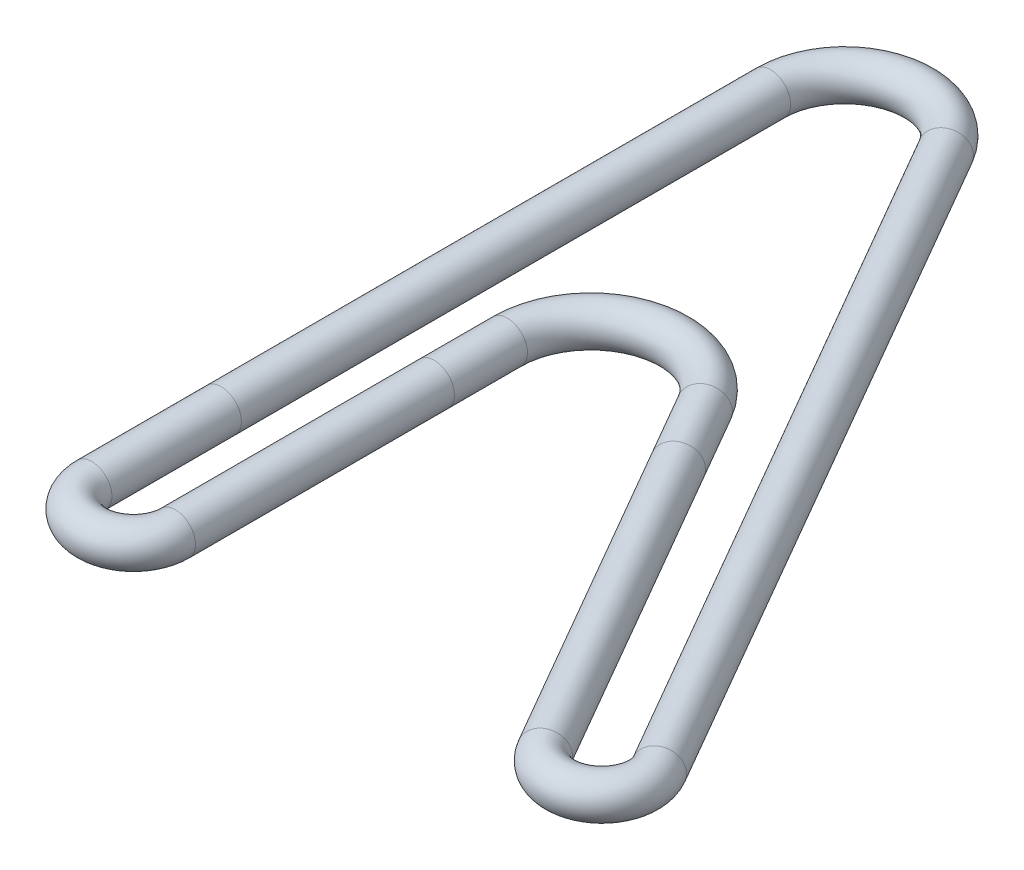
ISO-10303-21;
HEADER;
FILE_DESCRIPTION(('STEP AP214'),'2;1');
FILE_NAME('part.step','',(''),(''),'','','');
FILE_SCHEMA(('AUTOMOTIVE_DESIGN { 1 0 10303 214 1 1 1 1 }'));
ENDSEC;
DATA;
#1=APPLICATION_CONTEXT('core data for automotive mechanical design processes');
#2=APPLICATION_PROTOCOL_DEFINITION('international standard','automotive_design',2000,#1);
#3=PRODUCT_CONTEXT('',#1,'mechanical');
#4=PRODUCT('Part','Part','',(#3));
#5=PRODUCT_RELATED_PRODUCT_CATEGORY('part','',(#4));
#6=PRODUCT_DEFINITION_FORMATION('','',#4);
#7=PRODUCT_DEFINITION_CONTEXT('part definition',#1,'design');
#8=PRODUCT_DEFINITION('design','',#6,#7);
#9=PRODUCT_DEFINITION_SHAPE('','',#8);
#10=(LENGTH_UNIT() NAMED_UNIT(*) SI_UNIT(.MILLI.,.METRE.));
#11=(NAMED_UNIT(*) PLANE_ANGLE_UNIT() SI_UNIT($,.RADIAN.));
#12=(NAMED_UNIT(*) SI_UNIT($,.STERADIAN.) SOLID_ANGLE_UNIT());
#13=UNCERTAINTY_MEASURE_WITH_UNIT(LENGTH_MEASURE(1.E-05),#10,'distance_accuracy_value','');
#14=(GEOMETRIC_REPRESENTATION_CONTEXT(3) GLOBAL_UNCERTAINTY_ASSIGNED_CONTEXT((#13)) GLOBAL_UNIT_ASSIGNED_CONTEXT((#10,
#11,#12)) REPRESENTATION_CONTEXT('',''));
#15=CARTESIAN_POINT('',(0.,0.,0.));
#16=DIRECTION('',(0.,0.,1.));
#17=DIRECTION('',(1.,0.,0.));
#18=AXIS2_PLACEMENT_3D('',#15,#16,#17);
#19=CARTESIAN_POINT('',(-2.38125,0.,-6.34999999999999));
#20=DIRECTION('',(0.,0.,-1.));
#21=DIRECTION('',(-1.,0.,0.));
#22=AXIS2_PLACEMENT_3D('',#19,#20,#21);
#23=CYLINDRICAL_SURFACE('',#22,2.38125);
#24=CARTESIAN_POINT('',(-2.38125,0.,-21.5944419392821));
#25=DIRECTION('',(0.,0.,-1.));
#26=DIRECTION('',(-1.,0.,0.));
#27=AXIS2_PLACEMENT_3D('',#24,#25,#26);
#28=CIRCLE('',#27,2.38125);
#29=CARTESIAN_POINT('',(-4.7625,0.,-21.5944419392821));
#30=VERTEX_POINT('',#29);
#31=EDGE_CURVE('E68',#30,#30,#28,.T.);
#32=ORIENTED_EDGE('',*,*,#31,.F.);
#33=EDGE_LOOP('',(#32));
#34=FACE_BOUND('',#33,.T.);
#35=CARTESIAN_POINT('',(-2.38124999999996,0.,-6.34999999999999));
#36=DIRECTION('',(0.,0.,-1.));
#37=DIRECTION('',(-1.,0.,0.));
#38=AXIS2_PLACEMENT_3D('',#35,#36,#37);
#39=CIRCLE('',#38,2.38125);
#40=CARTESIAN_POINT('',(-4.7625,0.,-6.34999999999999));
#41=VERTEX_POINT('',#40);
#42=EDGE_CURVE('E10',#41,#41,#39,.T.);
#43=ORIENTED_EDGE('',*,*,#42,.T.);
#44=EDGE_LOOP('',(#43));
#45=FACE_BOUND('',#44,.T.);
#46=ADVANCED_FACE('F31',(#34,#45),#23,.T.);
#47=CARTESIAN_POINT('',(2.54,0.,-6.35));
#48=DIRECTION('',(0.,-1.,0.));
#49=DIRECTION('',(0.,0.,-1.));
#50=AXIS2_PLACEMENT_3D('',#47,#48,#49);
#51=TOROIDAL_SURFACE('',#50,4.92125,2.38125);
#52=CARTESIAN_POINT('',(7.46125,0.,-6.35));
#53=DIRECTION('',(0.,0.,1.));
#54=DIRECTION('',(1.,0.,0.));
#55=AXIS2_PLACEMENT_3D('',#52,#53,#54);
#56=CIRCLE('',#55,2.38125);
#57=CARTESIAN_POINT('',(9.8425,0.,-6.35));
#58=VERTEX_POINT('',#57);
#59=EDGE_CURVE('E37',#58,#58,#56,.T.);
#60=CARTESIAN_POINT('',(2.54,0.,-6.35));
#61=DIRECTION('',(0.,-1.,0.));
#62=DIRECTION('',(0.,0.,-1.));
#63=AXIS2_PLACEMENT_3D('',#60,#61,#62);
#64=CIRCLE('',#63,7.3025);
#65=EDGE_CURVE('',#58,#41,#64,.T.);
#66=ORIENTED_EDGE('',*,*,#59,.T.);
#67=ORIENTED_EDGE('',*,*,#42,.F.);
#68=ORIENTED_EDGE('',*,*,#65,.T.);
#69=ORIENTED_EDGE('',*,*,#65,.F.);
#70=EDGE_LOOP('',(#66,#68,#67,#69));
#71=FACE_BOUND('',#70,.T.);
#72=ADVANCED_FACE('F75',(#71),#51,.T.);
#73=CARTESIAN_POINT('',(7.46125,0.,-36.8388838785642));
#74=DIRECTION('',(0.,0.,1.));
#75=DIRECTION('',(1.,0.,0.));
#76=AXIS2_PLACEMENT_3D('',#73,#74,#75);
#77=CYLINDRICAL_SURFACE('',#76,2.38125);
#78=ORIENTED_EDGE('',*,*,#59,.F.);
#79=EDGE_LOOP('',(#78));
#80=FACE_BOUND('',#79,.T.);
#81=CARTESIAN_POINT('',(7.46125,0.,-36.8388838785642));
#82=DIRECTION('',(0.,0.,1.));
#83=DIRECTION('',(1.,0.,0.));
#84=AXIS2_PLACEMENT_3D('',#81,#82,#83);
#85=CIRCLE('',#84,2.38125);
#86=CARTESIAN_POINT('',(9.8425,0.,-36.8388838785642));
#87=VERTEX_POINT('',#86);
#88=EDGE_CURVE('E41',#87,#87,#85,.T.);
#89=ORIENTED_EDGE('',*,*,#88,.T.);
#90=EDGE_LOOP('',(#89));
#91=FACE_BOUND('',#90,.T.);
#92=ADVANCED_FACE('F79',(#80,#91),#77,.T.);
#93=CARTESIAN_POINT('',(7.46125,0.,-45.4453842408075));
#94=DIRECTION('',(0.,0.,1.));
#95=DIRECTION('',(1.,0.,0.));
#96=AXIS2_PLACEMENT_3D('',#93,#94,#95);
#97=CYLINDRICAL_SURFACE('',#96,2.38125);
#98=ORIENTED_EDGE('',*,*,#88,.F.);
#99=EDGE_LOOP('',(#98));
#100=FACE_BOUND('',#99,.T.);
#101=CARTESIAN_POINT('',(7.46125,0.,-45.4453842408075));
#102=DIRECTION('',(0.,0.,1.));
#103=DIRECTION('',(1.,0.,0.));
#104=AXIS2_PLACEMENT_3D('',#101,#102,#103);
#105=CIRCLE('',#104,2.38125);
#106=CARTESIAN_POINT('',(5.08,0.,-45.4453842408075));
#107=VERTEX_POINT('',#106);
#108=EDGE_CURVE('E45',#107,#107,#105,.T.);
#109=ORIENTED_EDGE('',*,*,#108,.T.);
#110=EDGE_LOOP('',(#109));
#111=FACE_BOUND('',#110,.T.);
#112=ADVANCED_FACE('F84',(#100,#111),#97,.T.);
#113=CARTESIAN_POINT('',(17.2933985542007,0.,-45.4453842408075));
#114=DIRECTION('',(0.,1.,0.));
#115=DIRECTION('',(0.,0.,1.));
#116=AXIS2_PLACEMENT_3D('',#113,#114,#115);
#117=TOROIDAL_SURFACE('',#116,9.83214855420072,2.38125);
#118=CARTESIAN_POINT('',(25.808288975921,0.,-50.3614585179079));
#119=DIRECTION('',(-0.500000000000001,0.,-0.866025403784438));
#120=DIRECTION('',(-0.866025403784438,0.,0.500000000000001));
#121=AXIS2_PLACEMENT_3D('',#118,#119,#120);
#122=CIRCLE('',#121,2.38125);
#123=CARTESIAN_POINT('',(27.8705119686827,0.,-51.5520835179079));
#124=VERTEX_POINT('',#123);
#125=EDGE_CURVE('E50',#124,#124,#122,.T.);
#126=CARTESIAN_POINT('',(17.2933985542007,0.,-45.4453842408075));
#127=DIRECTION('',(0.,1.,0.));
#128=DIRECTION('',(0.,0.,1.));
#129=AXIS2_PLACEMENT_3D('',#126,#127,#128);
#130=CIRCLE('',#129,12.2133985542007);
#131=EDGE_CURVE('',#124,#107,#130,.T.);
#132=ORIENTED_EDGE('',*,*,#125,.T.);
#133=ORIENTED_EDGE('',*,*,#108,.F.);
#134=ORIENTED_EDGE('',*,*,#131,.T.);
#135=ORIENTED_EDGE('',*,*,#131,.F.);
#136=EDGE_LOOP('',(#132,#134,#133,#135));
#137=FACE_BOUND('',#136,.T.);
#138=ADVANCED_FACE('F90',(#137),#117,.T.);
#139=CARTESIAN_POINT('',(30.1115391570426,0.,-42.9080105665252));
#140=DIRECTION('',(-0.500000000000001,0.,-0.866025403784438));
#141=DIRECTION('',(-0.866025403784438,0.,0.500000000000001));
#142=AXIS2_PLACEMENT_3D('',#139,#140,#141);
#143=CYLINDRICAL_SURFACE('',#142,2.38125);
#144=ORIENTED_EDGE('',*,*,#125,.F.);
#145=EDGE_LOOP('',(#144));
#146=FACE_BOUND('',#145,.T.);
#147=CARTESIAN_POINT('',(30.1115391570426,0.,-42.9080105665252));
#148=DIRECTION('',(-0.5,0.,-0.866025403784438));
#149=DIRECTION('',(-0.866025403784438,0.,0.5));
#150=AXIS2_PLACEMENT_3D('',#147,#148,#149);
#151=CIRCLE('',#150,2.38125);
#152=CARTESIAN_POINT('',(28.0493161642809,0.,-41.7173855665252));
#153=VERTEX_POINT('',#152);
#154=EDGE_CURVE('E53',#153,#153,#151,.T.);
#155=ORIENTED_EDGE('',*,*,#154,.T.);
#156=EDGE_LOOP('',(#155));
#157=FACE_BOUND('',#156,.T.);
#158=ADVANCED_FACE('F94',(#146,#157),#143,.T.);
#159=CARTESIAN_POINT('',(51.5391066419818,0.,-5.7943749999998));
#160=DIRECTION('',(-0.5,0.,-0.866025403784439));
#161=DIRECTION('',(-0.866025403784439,0.,0.5));
#162=AXIS2_PLACEMENT_3D('',#159,#160,#161);
#163=CYLINDRICAL_SURFACE('',#162,2.38125);
#164=ORIENTED_EDGE('',*,*,#154,.F.);
#165=EDGE_LOOP('',(#164));
#166=FACE_BOUND('',#165,.T.);
#167=CARTESIAN_POINT('',(51.5391066419818,0.,-5.7943749999998));
#168=DIRECTION('',(-0.499999999999998,0.,-0.86602540378444));
#169=DIRECTION('',(-0.86602540378444,0.,0.499999999999998));
#170=AXIS2_PLACEMENT_3D('',#167,#168,#169);
#171=CIRCLE('',#170,2.38125);
#172=CARTESIAN_POINT('',(49.4768836492201,0.,-4.60374999999981));
#173=VERTEX_POINT('',#172);
#174=EDGE_CURVE('E56',#173,#173,#171,.T.);
#175=ORIENTED_EDGE('',*,*,#174,.T.);
#176=EDGE_LOOP('',(#175));
#177=FACE_BOUND('',#176,.T.);
#178=ADVANCED_FACE('F98',(#166,#177),#163,.T.);
#179=CARTESIAN_POINT('',(55.8010341603559,0.,-8.25499999999979));
#180=DIRECTION('',(0.,-1.,0.));
#181=DIRECTION('',(0.,0.,-1.));
#182=AXIS2_PLACEMENT_3D('',#179,#180,#181);
#183=TOROIDAL_SURFACE('',#182,4.92125,2.38125);
#184=CARTESIAN_POINT('',(60.0629616787301,0.,-10.7156249999998));
#185=DIRECTION('',(0.5,0.,0.866025403784439));
#186=DIRECTION('',(0.866025403784439,0.,-0.5));
#187=AXIS2_PLACEMENT_3D('',#184,#185,#186);
#188=CIRCLE('',#187,2.38125);
#189=CARTESIAN_POINT('',(62.1251846714918,0.,-11.9062499999998));
#190=VERTEX_POINT('',#189);
#191=EDGE_CURVE('E59',#190,#190,#188,.T.);
#192=CARTESIAN_POINT('',(55.8010341603559,0.,-8.25499999999979));
#193=DIRECTION('',(0.,-1.,0.));
#194=DIRECTION('',(0.,0.,-1.));
#195=AXIS2_PLACEMENT_3D('',#192,#193,#194);
#196=CIRCLE('',#195,7.3025);
#197=EDGE_CURVE('',#190,#173,#196,.T.);
#198=ORIENTED_EDGE('',*,*,#191,.T.);
#199=ORIENTED_EDGE('',*,*,#174,.F.);
#200=ORIENTED_EDGE('',*,*,#197,.T.);
#201=ORIENTED_EDGE('',*,*,#197,.F.);
#202=EDGE_LOOP('',(#198,#200,#199,#201));
#203=FACE_BOUND('',#202,.T.);
#204=ADVANCED_FACE('F102',(#203),#183,.T.);
#205=CARTESIAN_POINT('',(13.9114843067929,0.,-90.6523286525604));
#206=DIRECTION('',(0.5,0.,0.866025403784439));
#207=DIRECTION('',(0.866025403784439,0.,-0.5));
#208=AXIS2_PLACEMENT_3D('',#205,#206,#207);
#209=CYLINDRICAL_SURFACE('',#208,2.38125);
#210=ORIENTED_EDGE('',*,*,#191,.F.);
#211=EDGE_LOOP('',(#210));
#212=FACE_BOUND('',#211,.T.);
#213=CARTESIAN_POINT('',(13.9114843067929,0.,-90.6523286525604));
#214=DIRECTION('',(0.500000000000004,0.,0.866025403784436));
#215=DIRECTION('',(0.866025403784436,0.,-0.500000000000004));
#216=AXIS2_PLACEMENT_3D('',#213,#214,#215);
#217=CIRCLE('',#216,2.38125);
#218=CARTESIAN_POINT('',(15.9737072995545,0.,-91.8429536525604));
#219=VERTEX_POINT('',#218);
#220=EDGE_CURVE('E62',#219,#219,#217,.T.);
#221=ORIENTED_EDGE('',*,*,#220,.T.);
#222=EDGE_LOOP('',(#221));
#223=FACE_BOUND('',#222,.T.);
#224=ADVANCED_FACE('F106',(#212,#223),#209,.T.);
#225=CARTESIAN_POINT('',(6.35,0.,-86.2867036525604));
#226=DIRECTION('',(0.,-1.,0.));
#227=DIRECTION('',(0.,0.,-1.));
#228=AXIS2_PLACEMENT_3D('',#225,#226,#227);
#229=TOROIDAL_SURFACE('',#228,8.73125,2.38125);
#230=CARTESIAN_POINT('',(-2.38125,0.,-86.2867036525604));
#231=DIRECTION('',(0.,0.,-1.));
#232=DIRECTION('',(-1.,0.,0.));
#233=AXIS2_PLACEMENT_3D('',#230,#231,#232);
#234=CIRCLE('',#233,2.38125);
#235=CARTESIAN_POINT('',(-4.7625,0.,-86.2867036525604));
#236=VERTEX_POINT('',#235);
#237=EDGE_CURVE('E65',#236,#236,#234,.T.);
#238=CARTESIAN_POINT('',(6.35,0.,-86.2867036525604));
#239=DIRECTION('',(0.,-1.,0.));
#240=DIRECTION('',(0.,0.,-1.));
#241=AXIS2_PLACEMENT_3D('',#238,#239,#240);
#242=CIRCLE('',#241,11.1125);
#243=EDGE_CURVE('',#236,#219,#242,.T.);
#244=ORIENTED_EDGE('',*,*,#237,.T.);
#245=ORIENTED_EDGE('',*,*,#220,.F.);
#246=ORIENTED_EDGE('',*,*,#243,.T.);
#247=ORIENTED_EDGE('',*,*,#243,.F.);
#248=EDGE_LOOP('',(#244,#246,#245,#247));
#249=FACE_BOUND('',#248,.T.);
#250=ADVANCED_FACE('F110',(#249),#229,.T.);
#251=CARTESIAN_POINT('',(-2.38125,0.,-21.5944419392821));
#252=DIRECTION('',(0.,0.,-1.));
#253=DIRECTION('',(-1.,0.,0.));
#254=AXIS2_PLACEMENT_3D('',#251,#252,#253);
#255=CYLINDRICAL_SURFACE('',#254,2.38125);
#256=ORIENTED_EDGE('',*,*,#237,.F.);
#257=EDGE_LOOP('',(#256));
#258=FACE_BOUND('',#257,.T.);
#259=ORIENTED_EDGE('',*,*,#31,.T.);
#260=EDGE_LOOP('',(#259));
#261=FACE_BOUND('',#260,.T.);
#262=ADVANCED_FACE('F72',(#258,#261),#255,.T.);
#263=CLOSED_SHELL('',(#46,#72,#92,#112,#138,#158,#178,#204,#224,#250,#262));
#264=MANIFOLD_SOLID_BREP('B2',#263);
#265=ADVANCED_BREP_SHAPE_REPRESENTATION('',(#18,#264),#14);
#266=SHAPE_DEFINITION_REPRESENTATION(#9,#265);
ENDSEC;
END-ISO-10303-21;
